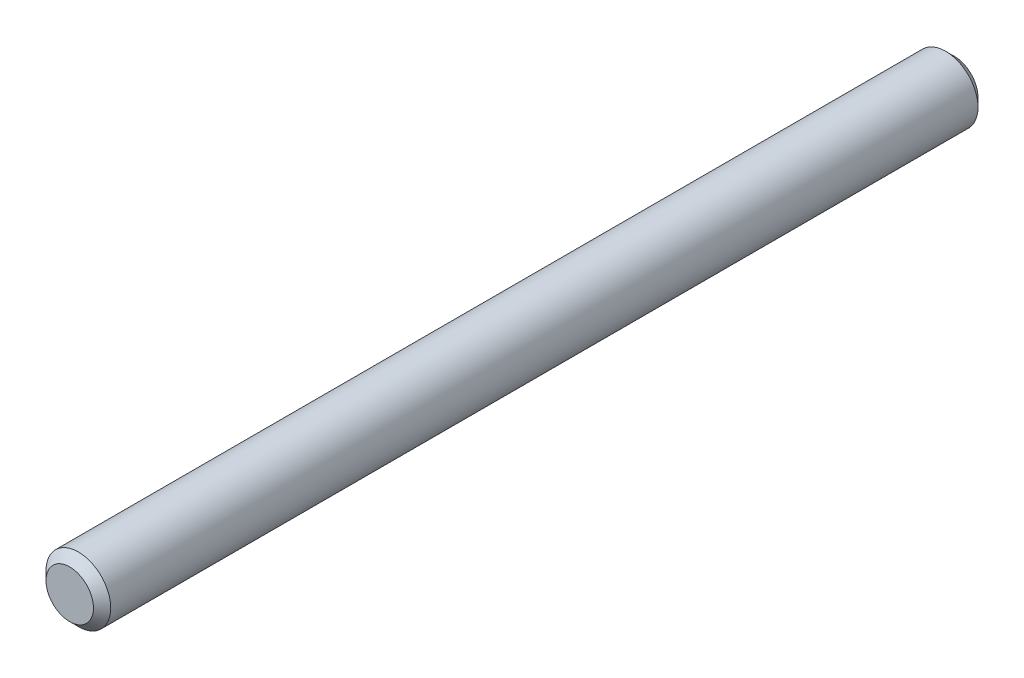
ISO-10303-21;
HEADER;
FILE_DESCRIPTION(('STEP AP214'),'2;1');
FILE_NAME('part.step','',(''),(''),'','','');
FILE_SCHEMA(('AUTOMOTIVE_DESIGN { 1 0 10303 214 1 1 1 1 }'));
ENDSEC;
DATA;
#1=APPLICATION_CONTEXT('core data for automotive mechanical design processes');
#2=APPLICATION_PROTOCOL_DEFINITION('international standard','automotive_design',2000,#1);
#3=PRODUCT_CONTEXT('',#1,'mechanical');
#4=PRODUCT('Part','Part','',(#3));
#5=PRODUCT_RELATED_PRODUCT_CATEGORY('part','',(#4));
#6=PRODUCT_DEFINITION_FORMATION('','',#4);
#7=PRODUCT_DEFINITION_CONTEXT('part definition',#1,'design');
#8=PRODUCT_DEFINITION('design','',#6,#7);
#9=PRODUCT_DEFINITION_SHAPE('','',#8);
#10=(LENGTH_UNIT() NAMED_UNIT(*) SI_UNIT(.MILLI.,.METRE.));
#11=(NAMED_UNIT(*) PLANE_ANGLE_UNIT() SI_UNIT($,.RADIAN.));
#12=(NAMED_UNIT(*) SI_UNIT($,.STERADIAN.) SOLID_ANGLE_UNIT());
#13=UNCERTAINTY_MEASURE_WITH_UNIT(LENGTH_MEASURE(1.E-05),#10,'distance_accuracy_value','');
#14=(GEOMETRIC_REPRESENTATION_CONTEXT(3) GLOBAL_UNCERTAINTY_ASSIGNED_CONTEXT((#13)) GLOBAL_UNIT_ASSIGNED_CONTEXT((#10,
#11,#12)) REPRESENTATION_CONTEXT('',''));
#15=CARTESIAN_POINT('',(0.,0.,0.));
#16=DIRECTION('',(0.,0.,1.));
#17=DIRECTION('',(1.,0.,0.));
#18=AXIS2_PLACEMENT_3D('',#15,#16,#17);
#19=CARTESIAN_POINT('',(0.,0.,-130.175));
#20=DIRECTION('',(0.,0.,1.));
#21=DIRECTION('',(1.,0.,0.));
#22=AXIS2_PLACEMENT_3D('',#19,#20,#21);
#23=CYLINDRICAL_SURFACE('',#22,4.7625);
#24=CARTESIAN_POINT('',(0.,0.,-1.27000000000002));
#25=DIRECTION('',(0.,0.,1.));
#26=DIRECTION('',(1.,0.,0.));
#27=AXIS2_PLACEMENT_3D('',#24,#25,#26);
#28=CIRCLE('',#27,4.7625);
#29=CARTESIAN_POINT('',(4.7625,0.,-1.27000000000002));
#30=VERTEX_POINT('',#29);
#31=EDGE_CURVE('E42',#30,#30,#28,.F.);
#32=ORIENTED_EDGE('',*,*,#31,.T.);
#33=EDGE_LOOP('',(#32));
#34=FACE_BOUND('',#33,.T.);
#35=CARTESIAN_POINT('',(0.,0.,-128.905));
#36=DIRECTION('',(0.,0.,1.));
#37=DIRECTION('',(1.,0.,0.));
#38=AXIS2_PLACEMENT_3D('',#35,#36,#37);
#39=CIRCLE('',#38,4.7625);
#40=CARTESIAN_POINT('',(4.76249999999999,0.,-128.905));
#41=VERTEX_POINT('',#40);
#42=EDGE_CURVE('E46',#41,#41,#39,.T.);
#43=ORIENTED_EDGE('',*,*,#42,.T.);
#44=EDGE_LOOP('',(#43));
#45=FACE_BOUND('',#44,.T.);
#46=ADVANCED_FACE('F35',(#34,#45),#23,.T.);
#47=CARTESIAN_POINT('',(0.,0.,-130.175));
#48=DIRECTION('',(0.,0.,1.));
#49=DIRECTION('',(1.,0.,0.));
#50=AXIS2_PLACEMENT_3D('',#47,#48,#49);
#51=PLANE('',#50);
#52=CARTESIAN_POINT('',(0.,0.,-130.175));
#53=DIRECTION('',(0.,0.,1.));
#54=DIRECTION('',(1.,0.,0.));
#55=AXIS2_PLACEMENT_3D('',#52,#53,#54);
#56=CIRCLE('',#55,3.49250000000001);
#57=CARTESIAN_POINT('',(3.4925,0.,-130.175));
#58=VERTEX_POINT('',#57);
#59=EDGE_CURVE('E10',#58,#58,#56,.F.);
#60=ORIENTED_EDGE('',*,*,#59,.T.);
#61=EDGE_LOOP('',(#60));
#62=FACE_BOUND('',#61,.T.);
#63=ADVANCED_FACE('F66',(#62),#51,.F.);
#64=CARTESIAN_POINT('',(0.,0.,0.));
#65=DIRECTION('',(0.,0.,1.));
#66=DIRECTION('',(1.,0.,0.));
#67=AXIS2_PLACEMENT_3D('',#64,#65,#66);
#68=PLANE('',#67);
#69=CARTESIAN_POINT('',(0.,0.,0.));
#70=DIRECTION('',(0.,0.,1.));
#71=DIRECTION('',(1.,0.,0.));
#72=AXIS2_PLACEMENT_3D('',#69,#70,#71);
#73=CIRCLE('',#72,3.4925);
#74=CARTESIAN_POINT('',(3.4925,0.,0.));
#75=VERTEX_POINT('',#74);
#76=EDGE_CURVE('E50',#75,#75,#73,.T.);
#77=ORIENTED_EDGE('',*,*,#76,.T.);
#78=EDGE_LOOP('',(#77));
#79=FACE_BOUND('',#78,.T.);
#80=ADVANCED_FACE('F56',(#79),#68,.T.);
#81=CARTESIAN_POINT('',(0.,0.,0.));
#82=DIRECTION('',(0.,0.,-1.));
#83=DIRECTION('',(-1.,0.,0.));
#84=AXIS2_PLACEMENT_3D('',#81,#82,#83);
#85=CONICAL_SURFACE('',#84,3.4925,0.785398163397442);
#86=ORIENTED_EDGE('',*,*,#31,.F.);
#87=EDGE_LOOP('',(#86));
#88=FACE_BOUND('',#87,.T.);
#89=ORIENTED_EDGE('',*,*,#76,.F.);
#90=EDGE_LOOP('',(#89));
#91=FACE_BOUND('',#90,.T.);
#92=ADVANCED_FACE('F58',(#88,#91),#85,.T.);
#93=CARTESIAN_POINT('',(0.,0.,-128.905));
#94=DIRECTION('',(0.,0.,1.));
#95=DIRECTION('',(1.,0.,0.));
#96=AXIS2_PLACEMENT_3D('',#93,#94,#95);
#97=CONICAL_SURFACE('',#96,4.7625,0.785398163397458);
#98=CARTESIAN_POINT('',(3.4925,0.,-130.175));
#99=CARTESIAN_POINT('',(3.50572916666666,0.,-130.161770833333));
#100=CARTESIAN_POINT('',(3.51895833333333,0.,-130.148541666667));
#101=CARTESIAN_POINT('',(3.54541666666666,0.,-130.122083333333));
#102=CARTESIAN_POINT('',(3.55864583333333,0.,-130.108854166667));
#103=CARTESIAN_POINT('',(3.58510416666666,0.,-130.082395833333));
#104=CARTESIAN_POINT('',(3.59833333333333,0.,-130.069166666667));
#105=CARTESIAN_POINT('',(3.62479166666666,0.,-130.042708333333));
#106=CARTESIAN_POINT('',(3.63802083333333,0.,-130.029479166667));
#107=CARTESIAN_POINT('',(3.66447916666666,0.,-130.003020833333));
#108=CARTESIAN_POINT('',(3.67770833333333,0.,-129.989791666667));
#109=CARTESIAN_POINT('',(3.70416666666666,0.,-129.963333333333));
#110=CARTESIAN_POINT('',(3.71739583333333,0.,-129.950104166667));
#111=CARTESIAN_POINT('',(3.74385416666666,0.,-129.923645833333));
#112=CARTESIAN_POINT('',(3.75708333333333,0.,-129.910416666667));
#113=CARTESIAN_POINT('',(3.78354166666666,0.,-129.883958333333));
#114=CARTESIAN_POINT('',(3.79677083333333,0.,-129.870729166667));
#115=CARTESIAN_POINT('',(3.82322916666666,0.,-129.844270833333));
#116=CARTESIAN_POINT('',(3.83645833333333,0.,-129.831041666667));
#117=CARTESIAN_POINT('',(3.86291666666666,0.,-129.804583333333));
#118=CARTESIAN_POINT('',(3.87614583333333,0.,-129.791354166667));
#119=CARTESIAN_POINT('',(3.90260416666666,0.,-129.764895833333));
#120=CARTESIAN_POINT('',(3.91583333333332,0.,-129.751666666667));
#121=CARTESIAN_POINT('',(3.94229166666666,0.,-129.725208333333));
#122=CARTESIAN_POINT('',(3.95552083333332,0.,-129.711979166667));
#123=CARTESIAN_POINT('',(3.98197916666666,0.,-129.685520833333));
#124=CARTESIAN_POINT('',(3.99520833333333,0.,-129.672291666667));
#125=CARTESIAN_POINT('',(4.02166666666666,0.,-129.645833333333));
#126=CARTESIAN_POINT('',(4.03489583333332,0.,-129.632604166667));
#127=CARTESIAN_POINT('',(4.06135416666666,0.,-129.606145833333));
#128=CARTESIAN_POINT('',(4.07458333333332,0.,-129.592916666667));
#129=CARTESIAN_POINT('',(4.10104166666666,0.,-129.566458333333));
#130=CARTESIAN_POINT('',(4.11427083333332,0.,-129.553229166667));
#131=CARTESIAN_POINT('',(4.14072916666666,0.,-129.526770833333));
#132=CARTESIAN_POINT('',(4.15395833333332,0.,-129.513541666667));
#133=CARTESIAN_POINT('',(4.18041666666666,0.,-129.487083333333));
#134=CARTESIAN_POINT('',(4.19364583333332,0.,-129.473854166667));
#135=CARTESIAN_POINT('',(4.22010416666666,0.,-129.447395833333));
#136=CARTESIAN_POINT('',(4.23333333333332,0.,-129.434166666667));
#137=CARTESIAN_POINT('',(4.25979166666666,0.,-129.407708333333));
#138=CARTESIAN_POINT('',(4.27302083333332,0.,-129.394479166667));
#139=CARTESIAN_POINT('',(4.29947916666666,0.,-129.368020833333));
#140=CARTESIAN_POINT('',(4.31270833333333,0.,-129.354791666667));
#141=CARTESIAN_POINT('',(4.33916666666666,0.,-129.328333333333));
#142=CARTESIAN_POINT('',(4.35239583333332,0.,-129.315104166667));
#143=CARTESIAN_POINT('',(4.37885416666665,0.,-129.288645833333));
#144=CARTESIAN_POINT('',(4.39208333333332,0.,-129.275416666667));
#145=CARTESIAN_POINT('',(4.41854166666666,0.,-129.248958333333));
#146=CARTESIAN_POINT('',(4.43177083333332,0.,-129.235729166667));
#147=CARTESIAN_POINT('',(4.45822916666666,0.,-129.209270833333));
#148=CARTESIAN_POINT('',(4.47145833333332,0.,-129.196041666667));
#149=CARTESIAN_POINT('',(4.49791666666666,0.,-129.169583333333));
#150=CARTESIAN_POINT('',(4.51114583333332,0.,-129.156354166667));
#151=CARTESIAN_POINT('',(4.53760416666665,0.,-129.129895833333));
#152=CARTESIAN_POINT('',(4.55083333333332,0.,-129.116666666667));
#153=CARTESIAN_POINT('',(4.57729166666665,0.,-129.090208333333));
#154=CARTESIAN_POINT('',(4.59052083333332,0.,-129.076979166667));
#155=CARTESIAN_POINT('',(4.61697916666665,0.,-129.050520833333));
#156=CARTESIAN_POINT('',(4.63020833333332,0.,-129.037291666667));
#157=CARTESIAN_POINT('',(4.65666666666665,0.,-129.010833333333));
#158=CARTESIAN_POINT('',(4.66989583333332,0.,-128.997604166667));
#159=CARTESIAN_POINT('',(4.69635416666665,0.,-128.971145833333));
#160=CARTESIAN_POINT('',(4.70958333333332,0.,-128.957916666667));
#161=CARTESIAN_POINT('',(4.73604166666666,0.,-128.931458333333));
#162=CARTESIAN_POINT('',(4.74927083333332,0.,-128.918229166667));
#163=CARTESIAN_POINT('',(4.76249999999999,0.,-128.905));
#164=B_SPLINE_CURVE_WITH_KNOTS('',3,(#98,#99,#100,#101,#102,#103,#104,#105,#106,#107,#108,#109,
#110,#111,#112,#113,#114,#115,#116,#117,#118,#119,#120,#121,#122,#123,#124,#125,#126,#127,#128,
#129,#130,#131,#132,#133,#134,#135,#136,#137,#138,#139,#140,#141,#142,#143,#144,#145,#146,#147,
#148,#149,#150,#151,#152,#153,#154,#155,#156,#157,#158,#159,#160,#161,#162,#163),.UNSPECIFIED.,
.F.,.F.,(4,2,2,2,2,2,2,2,2,2,2,2,2,2,2,2,2,2,2,2,2,2,2,2,2,2,2,2,2,2,2,2,4),(0.,
0.0561266007566991,0.112253201513378,0.168379802270058,0.224506403026737,0.280633003783417,
0.336759604540096,0.392886205296776,0.449012806053455,0.505139406810134,0.561266007566814,
0.617392608323513,0.673519209080192,0.729645809836872,0.785772410593551,0.84189901135023,
0.898025612106909,0.954152212863589,1.01027881362027,1.06640541437695,1.12253201513363,
1.17865861589031,1.23478521664701,1.29091181740369,1.34703841816036,1.40316501891704,
1.45929161967372,1.5154182204304,1.57154482118708,1.62767142194376,1.68379802270044,
1.73992462345712,1.79605122421382),.UNSPECIFIED.);
#165=EDGE_CURVE('BSEAM37',#58,#41,#164,.T.);
#166=ORIENTED_EDGE('',*,*,#59,.F.);
#167=ORIENTED_EDGE('',*,*,#42,.F.);
#168=ORIENTED_EDGE('',*,*,#165,.T.);
#169=ORIENTED_EDGE('',*,*,#165,.F.);
#170=EDGE_LOOP('',(#166,#168,#167,#169));
#171=FACE_BOUND('',#170,.T.);
#172=ADVANCED_FACE('F37',(#171),#97,.T.);
#173=CLOSED_SHELL('',(#46,#63,#80,#92,#172));
#174=MANIFOLD_SOLID_BREP('B2',#173);
#175=ADVANCED_BREP_SHAPE_REPRESENTATION('',(#18,#174),#14);
#176=SHAPE_DEFINITION_REPRESENTATION(#9,#175);
ENDSEC;
END-ISO-10303-21;
